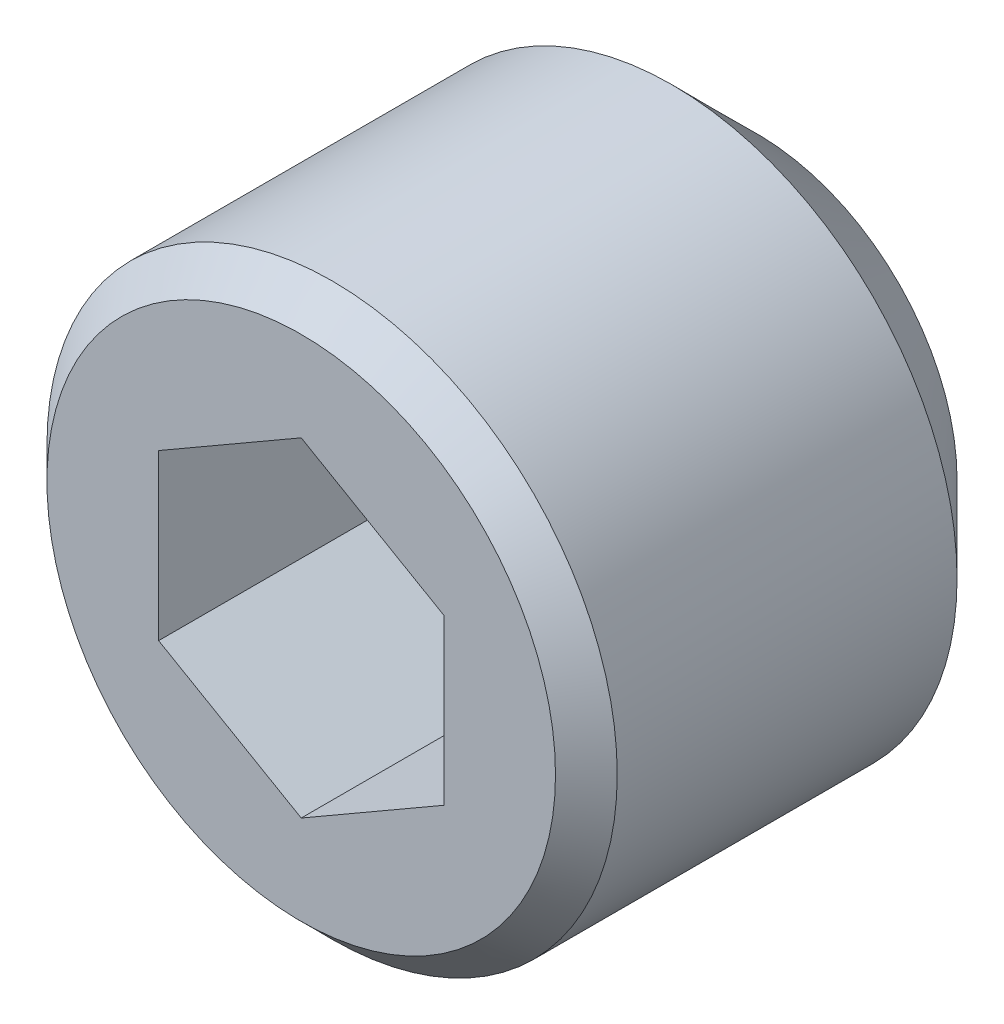
ISO-10303-21;
HEADER;
FILE_DESCRIPTION(('STEP AP214'),'2;1');
FILE_NAME('part.step','',(''),(''),'','','');
FILE_SCHEMA(('AUTOMOTIVE_DESIGN { 1 0 10303 214 1 1 1 1 }'));
ENDSEC;
DATA;
#1=APPLICATION_CONTEXT('core data for automotive mechanical design processes');
#2=APPLICATION_PROTOCOL_DEFINITION('international standard','automotive_design',2000,#1);
#3=PRODUCT_CONTEXT('',#1,'mechanical');
#4=PRODUCT('Part','Part','',(#3));
#5=PRODUCT_RELATED_PRODUCT_CATEGORY('part','',(#4));
#6=PRODUCT_DEFINITION_FORMATION('','',#4);
#7=PRODUCT_DEFINITION_CONTEXT('part definition',#1,'design');
#8=PRODUCT_DEFINITION('design','',#6,#7);
#9=PRODUCT_DEFINITION_SHAPE('','',#8);
#10=(LENGTH_UNIT() NAMED_UNIT(*) SI_UNIT(.MILLI.,.METRE.));
#11=(NAMED_UNIT(*) PLANE_ANGLE_UNIT() SI_UNIT($,.RADIAN.));
#12=(NAMED_UNIT(*) SI_UNIT($,.STERADIAN.) SOLID_ANGLE_UNIT());
#13=UNCERTAINTY_MEASURE_WITH_UNIT(LENGTH_MEASURE(1.E-05),#10,'distance_accuracy_value','');
#14=(GEOMETRIC_REPRESENTATION_CONTEXT(3) GLOBAL_UNCERTAINTY_ASSIGNED_CONTEXT((#13)) GLOBAL_UNIT_ASSIGNED_CONTEXT((#10,
#11,#12)) REPRESENTATION_CONTEXT('',''));
#15=CARTESIAN_POINT('',(0.,0.,0.));
#16=DIRECTION('',(0.,0.,1.));
#17=DIRECTION('',(1.,0.,0.));
#18=AXIS2_PLACEMENT_3D('',#15,#16,#17);
#19=CARTESIAN_POINT('',(0.,4.45875,0.));
#20=DIRECTION('',(0.,0.,-1.));
#21=DIRECTION('',(-1.,0.,0.));
#22=AXIS2_PLACEMENT_3D('',#19,#20,#21);
#23=PLANE('',#22);
#24=CARTESIAN_POINT('',(0.,0.,0.));
#25=DIRECTION('',(0.,0.,1.));
#26=DIRECTION('',(1.,0.,0.));
#27=AXIS2_PLACEMENT_3D('',#24,#25,#26);
#28=CIRCLE('',#27,4.45875);
#29=CARTESIAN_POINT('',(4.45875,0.,0.));
#30=VERTEX_POINT('',#29);
#31=EDGE_CURVE('E107',#30,#30,#28,.T.);
#32=ORIENTED_EDGE('',*,*,#31,.T.);
#33=EDGE_LOOP('',(#32));
#34=FACE_BOUND('',#33,.T.);
#35=DIRECTION('',(-0.866025403784438,-0.5,0.));
#36=VECTOR('',#35,1.);
#37=CARTESIAN_POINT('',(2.49999883437473,-1.443375,0.));
#38=LINE('',#37,#36);
#39=CARTESIAN_POINT('',(2.49999883437473,-1.443375,0.));
#40=VERTEX_POINT('',#39);
#41=CARTESIAN_POINT('',(0.,-2.88675,0.));
#42=VERTEX_POINT('',#41);
#43=EDGE_CURVE('E31',#40,#42,#38,.T.);
#44=ORIENTED_EDGE('',*,*,#43,.T.);
#45=DIRECTION('',(-0.866025403784439,0.5,0.));
#46=VECTOR('',#45,1.);
#47=CARTESIAN_POINT('',(0.,-2.88675,0.));
#48=LINE('',#47,#46);
#49=CARTESIAN_POINT('',(-2.49999883437473,-1.443375,0.));
#50=VERTEX_POINT('',#49);
#51=EDGE_CURVE('E153',#42,#50,#48,.T.);
#52=ORIENTED_EDGE('',*,*,#51,.T.);
#53=DIRECTION('',(0.,1.,0.));
#54=VECTOR('',#53,1.);
#55=CARTESIAN_POINT('',(-2.49999883437473,-1.443375,0.));
#56=LINE('',#55,#54);
#57=CARTESIAN_POINT('',(-2.49999883437473,1.443375,0.));
#58=VERTEX_POINT('',#57);
#59=EDGE_CURVE('E204',#50,#58,#56,.T.);
#60=ORIENTED_EDGE('',*,*,#59,.T.);
#61=DIRECTION('',(0.866025403784439,0.5,0.));
#62=VECTOR('',#61,1.);
#63=CARTESIAN_POINT('',(-2.49999883437473,1.443375,0.));
#64=LINE('',#63,#62);
#65=CARTESIAN_POINT('',(0.,2.88675,0.));
#66=VERTEX_POINT('',#65);
#67=EDGE_CURVE('E202',#58,#66,#64,.T.);
#68=ORIENTED_EDGE('',*,*,#67,.T.);
#69=DIRECTION('',(0.866025403784439,-0.5,0.));
#70=VECTOR('',#69,1.);
#71=CARTESIAN_POINT('',(0.,2.88675,0.));
#72=LINE('',#71,#70);
#73=CARTESIAN_POINT('',(2.49999883437473,1.443375,0.));
#74=VERTEX_POINT('',#73);
#75=EDGE_CURVE('E96',#66,#74,#72,.T.);
#76=ORIENTED_EDGE('',*,*,#75,.T.);
#77=DIRECTION('',(0.,-1.,0.));
#78=VECTOR('',#77,1.);
#79=CARTESIAN_POINT('',(2.49999883437473,1.443375,0.));
#80=LINE('',#79,#78);
#81=EDGE_CURVE('E92',#74,#40,#80,.T.);
#82=ORIENTED_EDGE('',*,*,#81,.T.);
#83=EDGE_LOOP('',(#44,#52,#60,#68,#76,#82));
#84=FACE_BOUND('',#83,.T.);
#85=ADVANCED_FACE('F17',(#34,#84),#23,.F.);
#86=CARTESIAN_POINT('',(0.,0.,-8.));
#87=DIRECTION('',(0.,0.,1.));
#88=DIRECTION('',(1.,0.,0.));
#89=AXIS2_PLACEMENT_3D('',#86,#87,#88);
#90=PLANE('',#89);
#91=CARTESIAN_POINT('',(0.,0.,-8.));
#92=DIRECTION('',(0.,0.,1.));
#93=DIRECTION('',(1.,0.,0.));
#94=AXIS2_PLACEMENT_3D('',#91,#92,#93);
#95=CIRCLE('',#94,3.5);
#96=CARTESIAN_POINT('',(3.5,0.,-8.));
#97=VERTEX_POINT('',#96);
#98=EDGE_CURVE('E11',#97,#97,#95,.T.);
#99=ORIENTED_EDGE('',*,*,#98,.F.);
#100=EDGE_LOOP('',(#99));
#101=FACE_BOUND('',#100,.T.);
#102=ADVANCED_FACE('F120',(#101),#90,.F.);
#103=CARTESIAN_POINT('',(0.,0.,-8.));
#104=DIRECTION('',(0.,0.,1.));
#105=DIRECTION('',(1.,0.,0.));
#106=AXIS2_PLACEMENT_3D('',#103,#104,#105);
#107=CONICAL_SURFACE('',#106,3.5,0.785398163397449);
#108=CARTESIAN_POINT('',(0.,0.,-6.5));
#109=DIRECTION('',(0.,0.,1.));
#110=DIRECTION('',(1.,0.,0.));
#111=AXIS2_PLACEMENT_3D('',#108,#109,#110);
#112=CIRCLE('',#111,5.);
#113=CARTESIAN_POINT('',(5.,0.,-6.5));
#114=VERTEX_POINT('',#113);
#115=EDGE_CURVE('E24',#114,#114,#112,.T.);
#116=ORIENTED_EDGE('',*,*,#115,.F.);
#117=EDGE_LOOP('',(#116));
#118=FACE_BOUND('',#117,.T.);
#119=ORIENTED_EDGE('',*,*,#98,.T.);
#120=EDGE_LOOP('',(#119));
#121=FACE_BOUND('',#120,.T.);
#122=ADVANCED_FACE('F117',(#118,#121),#107,.T.);
#123=CARTESIAN_POINT('',(0.,0.,0.));
#124=DIRECTION('',(0.,0.,1.));
#125=DIRECTION('',(1.,0.,0.));
#126=AXIS2_PLACEMENT_3D('',#123,#124,#125);
#127=CYLINDRICAL_SURFACE('',#126,5.);
#128=CARTESIAN_POINT('',(0.,0.,-0.54125));
#129=DIRECTION('',(0.,0.,1.));
#130=DIRECTION('',(1.,0.,0.));
#131=AXIS2_PLACEMENT_3D('',#128,#129,#130);
#132=CIRCLE('',#131,5.);
#133=CARTESIAN_POINT('',(5.,0.,-0.54125));
#134=VERTEX_POINT('',#133);
#135=EDGE_CURVE('E110',#134,#134,#132,.T.);
#136=ORIENTED_EDGE('',*,*,#135,.F.);
#137=EDGE_LOOP('',(#136));
#138=FACE_BOUND('',#137,.T.);
#139=ORIENTED_EDGE('',*,*,#115,.T.);
#140=EDGE_LOOP('',(#139));
#141=FACE_BOUND('',#140,.T.);
#142=ADVANCED_FACE('F115',(#138,#141),#127,.T.);
#143=CARTESIAN_POINT('',(0.,0.,-0.54125));
#144=DIRECTION('',(0.,0.,-1.));
#145=DIRECTION('',(-1.,0.,0.));
#146=AXIS2_PLACEMENT_3D('',#143,#144,#145);
#147=CONICAL_SURFACE('',#146,5.,0.785398163397448);
#148=ORIENTED_EDGE('',*,*,#31,.F.);
#149=EDGE_LOOP('',(#148));
#150=FACE_BOUND('',#149,.T.);
#151=ORIENTED_EDGE('',*,*,#135,.T.);
#152=EDGE_LOOP('',(#151));
#153=FACE_BOUND('',#152,.T.);
#154=ADVANCED_FACE('F133',(#150,#153),#147,.T.);
#155=CARTESIAN_POINT('',(2.49999883437473,-1.443375,-5.66666588958315));
#156=DIRECTION('',(-0.5,0.866025403784438,0.));
#157=DIRECTION('',(0.866025403784439,0.5,0.));
#158=AXIS2_PLACEMENT_3D('',#155,#156,#157);
#159=PLANE('',#158);
#160=DIRECTION('',(0.,0.,1.));
#161=VECTOR('',#160,1.);
#162=CARTESIAN_POINT('',(0.,-2.88675,-5.66666588958315));
#163=LINE('',#162,#161);
#164=CARTESIAN_POINT('',(0.,-2.88675,-4.));
#165=VERTEX_POINT('',#164);
#166=EDGE_CURVE('E105',#165,#42,#163,.T.);
#167=ORIENTED_EDGE('',*,*,#166,.T.);
#168=ORIENTED_EDGE('',*,*,#43,.F.);
#169=DIRECTION('',(0.,0.,1.));
#170=VECTOR('',#169,1.);
#171=CARTESIAN_POINT('',(2.49999883437473,-1.443375,-5.66666588958315));
#172=LINE('',#171,#170);
#173=CARTESIAN_POINT('',(2.49999883437473,-1.443375,-4.));
#174=VERTEX_POINT('',#173);
#175=EDGE_CURVE('E86',#174,#40,#172,.T.);
#176=ORIENTED_EDGE('',*,*,#175,.F.);
#177=CARTESIAN_POINT('',(-1.99999999401565E-07,-2.88675011547006,-3.99999993333333));
#178=CARTESIAN_POINT('',(0.10985961160669,-2.82332252366581,-4.03663049032172));
#179=CARTESIAN_POINT('',(0.220667731536841,-2.75934742579574,-4.06994406563847));
#180=CARTESIAN_POINT('',(0.444202540147257,-2.63028954387127,-4.12809191272334));
#181=CARTESIAN_POINT('',(0.556933199317606,-2.56520446745334,-4.15290561622927));
#182=CARTESIAN_POINT('',(0.78099750300855,-2.43584088140159,-4.19152993731165));
#183=CARTESIAN_POINT('',(0.892296682007637,-2.37158227044588,-4.20559765108009));
#184=CARTESIAN_POINT('',(1.11541846658836,-2.24276284805614,-4.22238842945382));
#185=CARTESIAN_POINT('',(1.22724026173863,-2.17820250452486,-4.22512540160635));
#186=CARTESIAN_POINT('',(1.43616731638533,-2.05757841328359,-4.21941704310204));
#187=CARTESIAN_POINT('',(1.53330392697905,-2.00149656500914,-4.2123733036678));
#188=CARTESIAN_POINT('',(1.72694433478895,-1.8896982234341,-4.19005329169059));
#189=CARTESIAN_POINT('',(1.82344746275382,-1.83398211652594,-4.17476940212666));
#190=CARTESIAN_POINT('',(2.01748678854571,-1.72195345954662,-4.13656263384661));
#191=CARTESIAN_POINT('',(2.11499844044762,-1.66565508107193,-4.11347787458928));
#192=CARTESIAN_POINT('',(2.3085677780308,-1.55389777191142,-4.06108522951028));
#193=CARTESIAN_POINT('',(2.40462794164891,-1.49843741058811,-4.03178964598496));
#194=CARTESIAN_POINT('',(2.49999903437473,-1.44337488452994,-3.99999993333333));
#195=B_SPLINE_CURVE_WITH_KNOTS('',3,(#177,#178,#179,#180,#181,#182,#183,#184,#185,#186,#187,
#188,#189,#190,#191,#192,#193,#194),.UNSPECIFIED.,.F.,.F.,(4,2,2,2,2,2,2,2,4),(0.,
0.396269845497157,0.793491933375094,1.18088400346178,1.56780044062153,1.90463400294076,
2.24177946228527,2.58640119548574,2.93034658115087),.UNSPECIFIED.);
#196=EDGE_CURVE('E79',#165,#174,#195,.T.);
#197=ORIENTED_EDGE('',*,*,#196,.F.);
#198=EDGE_LOOP('',(#167,#168,#176,#197));
#199=FACE_BOUND('',#198,.T.);
#200=ADVANCED_FACE('F87',(#199),#159,.T.);
#201=CARTESIAN_POINT('',(0.,-2.88675,-5.66666588958315));
#202=DIRECTION('',(0.5,0.866025403784439,0.));
#203=DIRECTION('',(0.866025403784439,-0.5,0.));
#204=AXIS2_PLACEMENT_3D('',#201,#202,#203);
#205=PLANE('',#204);
#206=DIRECTION('',(0.,0.,1.));
#207=VECTOR('',#206,1.);
#208=CARTESIAN_POINT('',(-2.49999883437473,-1.443375,-5.66666588958315));
#209=LINE('',#208,#207);
#210=CARTESIAN_POINT('',(-2.49999883437473,-1.443375,-4.));
#211=VERTEX_POINT('',#210);
#212=EDGE_CURVE('E103',#211,#50,#209,.T.);
#213=ORIENTED_EDGE('',*,*,#212,.T.);
#214=ORIENTED_EDGE('',*,*,#51,.F.);
#215=ORIENTED_EDGE('',*,*,#166,.F.);
#216=CARTESIAN_POINT('',(-2.49999903437473,-1.44337488452995,-3.99999993333333));
#217=CARTESIAN_POINT('',(-2.39013922276804,-1.50680247633419,-4.03663049032172));
#218=CARTESIAN_POINT('',(-2.27933110283789,-1.57077757420426,-4.06994406563847));
#219=CARTESIAN_POINT('',(-2.05579629422747,-1.69983545612873,-4.12809191272334));
#220=CARTESIAN_POINT('',(-1.94306563505712,-1.76492053254666,-4.15290561622927));
#221=CARTESIAN_POINT('',(-1.71900133136618,-1.89428411859841,-4.19152993731165));
#222=CARTESIAN_POINT('',(-1.60770215236709,-1.95854272955412,-4.20559765108009));
#223=CARTESIAN_POINT('',(-1.38458036778637,-2.08736215194387,-4.22238842945383));
#224=CARTESIAN_POINT('',(-1.2727585726361,-2.15192249547514,-4.22512540160635));
#225=CARTESIAN_POINT('',(-1.06383151798939,-2.27254658671641,-4.21941704310204));
#226=CARTESIAN_POINT('',(-0.966694907395679,-2.32862843499086,-4.2123733036678));
#227=CARTESIAN_POINT('',(-0.773054499585779,-2.4404267765659,-4.19005329169059));
#228=CARTESIAN_POINT('',(-0.676551371620906,-2.49614288347406,-4.17476940212666));
#229=CARTESIAN_POINT('',(-0.482512045829019,-2.60817154045338,-4.13656263384662));
#230=CARTESIAN_POINT('',(-0.385000393927105,-2.66446991892807,-4.11347787458929));
#231=CARTESIAN_POINT('',(-0.191431056343927,-2.77622722808858,-4.06108522951028));
#232=CARTESIAN_POINT('',(-0.0953708927258206,-2.83168758941189,-4.03178964598496));
#233=CARTESIAN_POINT('',(2.00000001119725E-07,-2.88675011547006,-3.99999993333333));
#234=B_SPLINE_CURVE_WITH_KNOTS('',3,(#216,#217,#218,#219,#220,#221,#222,#223,#224,#225,#226,
#227,#228,#229,#230,#231,#232,#233),.UNSPECIFIED.,.F.,.F.,(4,2,2,2,2,2,2,2,4),(0.,
0.396269845497158,0.793491933375095,1.18088400346178,1.56780044062153,1.90463400294076,
2.24177946228527,2.58640119548574,2.93034658115087),.UNSPECIFIED.);
#235=EDGE_CURVE('E83',#211,#165,#234,.T.);
#236=ORIENTED_EDGE('',*,*,#235,.F.);
#237=EDGE_LOOP('',(#213,#214,#215,#236));
#238=FACE_BOUND('',#237,.T.);
#239=ADVANCED_FACE('F141',(#238),#205,.T.);
#240=CARTESIAN_POINT('',(-2.49999883437473,-1.443375,-5.66666588958315));
#241=DIRECTION('',(1.,0.,0.));
#242=DIRECTION('',(0.,-1.,0.));
#243=AXIS2_PLACEMENT_3D('',#240,#241,#242);
#244=PLANE('',#243);
#245=DIRECTION('',(0.,0.,1.));
#246=VECTOR('',#245,1.);
#247=CARTESIAN_POINT('',(-2.49999883437473,1.443375,-5.66666588958315));
#248=LINE('',#247,#246);
#249=CARTESIAN_POINT('',(-2.49999883437473,1.443375,-4.));
#250=VERTEX_POINT('',#249);
#251=EDGE_CURVE('E101',#250,#58,#248,.T.);
#252=ORIENTED_EDGE('',*,*,#251,.T.);
#253=ORIENTED_EDGE('',*,*,#59,.F.);
#254=ORIENTED_EDGE('',*,*,#212,.F.);
#255=CARTESIAN_POINT('',(-2.49999883437473,-3.73786106080538,-3.07041221157194));
#256=CARTESIAN_POINT('',(-2.49999883437472,-3.62990250206732,-3.12220664287122));
#257=CARTESIAN_POINT('',(-2.49999883437472,-3.52168094152775,-3.17346309581262));
#258=CARTESIAN_POINT('',(-2.49999883437472,-3.30457164380933,-3.27459485889545));
#259=CARTESIAN_POINT('',(-2.49999883437473,-3.19568379099059,-3.32446992047824));
#260=CARTESIAN_POINT('',(-2.49999883437473,-2.97647740444845,-3.42281234276485));
#261=CARTESIAN_POINT('',(-2.49999883437473,-2.86615419888697,-3.47126932906307));
#262=CARTESIAN_POINT('',(-2.49999883437473,-2.64458202766207,-3.56601036918079));
#263=CARTESIAN_POINT('',(-2.49999883437473,-2.53333311048903,-3.61229453598331));
#264=CARTESIAN_POINT('',(-2.49999883437473,-2.30680205753004,-3.70328992467512));
#265=CARTESIAN_POINT('',(-2.49999883437473,-2.19149051987882,-3.74792838115549));
#266=CARTESIAN_POINT('',(-2.49999883437473,-1.95947266345193,-3.8334940158411));
#267=CARTESIAN_POINT('',(-2.49999883437473,-1.84276618467434,-3.87442076359324));
#268=CARTESIAN_POINT('',(-2.49999883437473,-1.60804233885086,-3.95139261003084));
#269=CARTESIAN_POINT('',(-2.49999883437473,-1.49002871420931,-3.98744899818757));
#270=CARTESIAN_POINT('',(-2.49999883437473,-1.2523101438379,-4.05344705166944));
#271=CARTESIAN_POINT('',(-2.49999883437473,-1.13260562607739,-4.08339023562997));
#272=CARTESIAN_POINT('',(-2.49999883437473,-0.89175462475313,-4.13556568390413));
#273=CARTESIAN_POINT('',(-2.49999883437473,-0.770611639993448,-4.15781378548432));
#274=CARTESIAN_POINT('',(-2.49999883437473,-0.5269703393632,-4.19314222529211));
#275=CARTESIAN_POINT('',(-2.49999883437473,-0.404472115650476,-4.20622318305106));
#276=CARTESIAN_POINT('',(-2.49999883437473,-0.160266323382075,-4.2220036785792));
#277=CARTESIAN_POINT('',(-2.49999883437472,-0.0385668671239495,-4.22482572411308));
#278=CARTESIAN_POINT('',(-2.49999883437473,0.204641816247535,-4.22016410990035));
#279=CARTESIAN_POINT('',(-2.49999883437473,0.326151031115554,-4.21267981202642));
#280=CARTESIAN_POINT('',(-2.49999883437473,0.536550258216571,-4.19130128655531));
#281=CARTESIAN_POINT('',(-2.49999883437473,0.625672904642507,-4.17959110975167));
#282=CARTESIAN_POINT('',(-2.49999883437473,0.803172917295863,-4.15143172061358));
#283=CARTESIAN_POINT('',(-2.49999883437473,0.89155015184042,-4.13498168827596));
#284=CARTESIAN_POINT('',(-2.49999883437473,1.15551819027777,-4.07939182444342));
#285=CARTESIAN_POINT('',(-2.49999883437473,1.32980784061724,-4.03402791877732));
#286=CARTESIAN_POINT('',(-2.49999883437473,1.59042319534384,-3.95652590664815));
#287=CARTESIAN_POINT('',(-2.49999883437473,1.67812270299027,-3.92875434787049));
#288=CARTESIAN_POINT('',(-2.49999883437473,1.85261386500735,-3.87064301388239));
#289=CARTESIAN_POINT('',(-2.49999883437473,1.93940604847369,-3.84030484144072));
#290=CARTESIAN_POINT('',(-2.49999883437473,2.11219207993987,-3.77749987485625));
#291=CARTESIAN_POINT('',(-2.49999883437473,2.19818606979953,-3.74503346755841));
#292=CARTESIAN_POINT('',(-2.49999883437473,2.36949689832585,-3.67832370020374));
#293=CARTESIAN_POINT('',(-2.49999883437473,2.45481361975971,-3.64408003992356));
#294=CARTESIAN_POINT('',(-2.49999883437473,2.67258663691751,-3.5544775289021));
#295=CARTESIAN_POINT('',(-2.49999883437473,2.80460717975266,-3.49806097487821));
#296=CARTESIAN_POINT('',(-2.49999883437473,3.06745885209088,-3.38251374932939));
#297=CARTESIAN_POINT('',(-2.49999883437473,3.19828989160955,-3.32338287448291));
#298=CARTESIAN_POINT('',(-2.49999883437473,3.45900849771502,-3.20302339623139));
#299=CARTESIAN_POINT('',(-2.49999883437473,3.588895895855,-3.14179442893665));
#300=CARTESIAN_POINT('',(-2.49999883437473,3.84788844979156,-3.01770131069641));
#301=CARTESIAN_POINT('',(-2.49999883437473,3.97699358811348,-2.95483712338704));
#302=CARTESIAN_POINT('',(-2.49999883437473,4.36366789578639,-2.76416837589586));
#303=CARTESIAN_POINT('',(-2.49999883437473,4.62028438307696,-2.63443362109789));
#304=CARTESIAN_POINT('',(-2.49999883437473,5.13176032193984,-2.37164618514162));
#305=CARTESIAN_POINT('',(-2.49999883437473,5.38661999164569,-2.23859392572743));
#306=CARTESIAN_POINT('',(-2.49999883437473,5.87112445771686,-1.98285372670787));
#307=CARTESIAN_POINT('',(-2.49999883437473,6.1008787283855,-1.86037285506766));
#308=CARTESIAN_POINT('',(-2.49999883437473,6.55964828623937,-1.61401665056899));
#309=CARTESIAN_POINT('',(-2.49999883437473,6.78866354567112,-1.49014126610625));
#310=CARTESIAN_POINT('',(-2.49999883437473,7.24554286262024,-1.24166107037196));
#311=CARTESIAN_POINT('',(-2.49999883437473,7.47340836663001,-1.11705891580744));
#312=CARTESIAN_POINT('',(-2.49999883437473,7.92867868321813,-0.867043623047067));
#313=CARTESIAN_POINT('',(-2.49999883437473,8.15608351928125,-0.741630527632687));
#314=CARTESIAN_POINT('',(-2.49999883437473,8.38332285644868,-0.615920192581907));
#315=B_SPLINE_CURVE_WITH_KNOTS('',3,(#255,#256,#257,#258,#259,#260,#261,#262,#263,#264,#265,
#266,#267,#268,#269,#270,#271,#272,#273,#274,#275,#276,#277,#278,#279,#280,#281,#282,#283,#284,
#285,#286,#287,#288,#289,#290,#291,#292,#293,#294,#295,#296,#297,#298,#299,#300,#301,#302,#303,
#304,#305,#306,#307,#308,#309,#310,#311,#312,#313,#314),.UNSPECIFIED.,.F.,.F.,(4,2,2,2,2,2,2,2,
2,2,2,2,2,2,2,2,2,2,2,2,2,2,2,2,2,2,2,2,2,4),(0.,0.359225681431817,0.718515585139895,
1.07998495417534,1.44143550653757,1.81233642904487,2.18328031069956,2.55334902389717,
2.92332569287424,3.29253631672425,3.66172198627915,4.02648423442986,4.39126906820634,
4.66080188136147,4.930381352183,5.46995360256796,5.74590907077785,6.021693467888,
6.29742787448485,6.57320901222719,7.00387397984081,7.43457126007159,7.86534362162853,
8.29612557086707,9.1587214959853,10.0212083154897,10.8022890544959,11.5833987932307,
12.3625217727531,13.1416039793722),.UNSPECIFIED.);
#316=EDGE_CURVE('E178',#250,#211,#315,.F.);
#317=ORIENTED_EDGE('',*,*,#316,.F.);
#318=EDGE_LOOP('',(#252,#253,#254,#317));
#319=FACE_BOUND('',#318,.T.);
#320=ADVANCED_FACE('F182',(#319),#244,.T.);
#321=CARTESIAN_POINT('',(-2.49999883437473,1.443375,-5.66666588958315));
#322=DIRECTION('',(0.5,-0.866025403784438,0.));
#323=DIRECTION('',(-0.866025403784439,-0.5,0.));
#324=AXIS2_PLACEMENT_3D('',#321,#322,#323);
#325=PLANE('',#324);
#326=DIRECTION('',(0.,0.,1.));
#327=VECTOR('',#326,1.);
#328=CARTESIAN_POINT('',(0.,2.88675,-5.66666588958315));
#329=LINE('',#328,#327);
#330=CARTESIAN_POINT('',(0.,2.88675,-4.));
#331=VERTEX_POINT('',#330);
#332=EDGE_CURVE('E94',#331,#66,#329,.T.);
#333=ORIENTED_EDGE('',*,*,#332,.T.);
#334=ORIENTED_EDGE('',*,*,#67,.F.);
#335=ORIENTED_EDGE('',*,*,#251,.F.);
#336=CARTESIAN_POINT('',(2.0000000023838E-07,2.88675011547006,-3.99999993333333));
#337=CARTESIAN_POINT('',(-0.10985961160669,2.82332252366581,-4.03663049032172));
#338=CARTESIAN_POINT('',(-0.220667731536841,2.75934742579574,-4.06994406563847));
#339=CARTESIAN_POINT('',(-0.444202540147257,2.63028954387127,-4.12809191272334));
#340=CARTESIAN_POINT('',(-0.556933199317606,2.56520446745334,-4.15290561622927));
#341=CARTESIAN_POINT('',(-0.78099750300855,2.43584088140159,-4.19152993731165));
#342=CARTESIAN_POINT('',(-0.892296682007636,2.37158227044588,-4.20559765108009));
#343=CARTESIAN_POINT('',(-1.11541846658836,2.24276284805614,-4.22238842945382));
#344=CARTESIAN_POINT('',(-1.22724026173863,2.17820250452486,-4.22512540160635));
#345=CARTESIAN_POINT('',(-1.43616731638533,2.05757841328359,-4.21941704310204));
#346=CARTESIAN_POINT('',(-1.53330392697905,2.00149656500914,-4.2123733036678));
#347=CARTESIAN_POINT('',(-1.72694433478895,1.8896982234341,-4.19005329169059));
#348=CARTESIAN_POINT('',(-1.82344746275382,1.83398211652594,-4.17476940212666));
#349=CARTESIAN_POINT('',(-2.01748678854571,1.72195345954662,-4.13656263384661));
#350=CARTESIAN_POINT('',(-2.11499844044762,1.66565508107193,-4.11347787458928));
#351=CARTESIAN_POINT('',(-2.3085677780308,1.55389777191142,-4.06108522951028));
#352=CARTESIAN_POINT('',(-2.40462794164891,1.49843741058811,-4.03178964598496));
#353=CARTESIAN_POINT('',(-2.49999903437473,1.44337488452994,-3.99999993333333));
#354=B_SPLINE_CURVE_WITH_KNOTS('',3,(#336,#337,#338,#339,#340,#341,#342,#343,#344,#345,#346,
#347,#348,#349,#350,#351,#352,#353),.UNSPECIFIED.,.F.,.F.,(4,2,2,2,2,2,2,2,4),(0.,
0.396269845497158,0.793491933375094,1.18088400346178,1.56780044062153,1.90463400294076,
2.24177946228527,2.58640119548574,2.93034658115087),.UNSPECIFIED.);
#355=EDGE_CURVE('E173',#331,#250,#354,.T.);
#356=ORIENTED_EDGE('',*,*,#355,.F.);
#357=EDGE_LOOP('',(#333,#334,#335,#356));
#358=FACE_BOUND('',#357,.T.);
#359=ADVANCED_FACE('F185',(#358),#325,.T.);
#360=CARTESIAN_POINT('',(0.,2.88675,-5.66666588958315));
#361=DIRECTION('',(-0.5,-0.866025403784439,0.));
#362=DIRECTION('',(-0.866025403784439,0.5,0.));
#363=AXIS2_PLACEMENT_3D('',#360,#361,#362);
#364=PLANE('',#363);
#365=DIRECTION('',(0.,0.,1.));
#366=VECTOR('',#365,1.);
#367=CARTESIAN_POINT('',(2.49999883437473,1.443375,-5.66666588958315));
#368=LINE('',#367,#366);
#369=CARTESIAN_POINT('',(2.49999883437473,1.443375,-4.));
#370=VERTEX_POINT('',#369);
#371=EDGE_CURVE('E91',#370,#74,#368,.T.);
#372=ORIENTED_EDGE('',*,*,#371,.T.);
#373=ORIENTED_EDGE('',*,*,#75,.F.);
#374=ORIENTED_EDGE('',*,*,#332,.F.);
#375=CARTESIAN_POINT('',(2.49999903437473,1.44337488452995,-3.99999993333333));
#376=CARTESIAN_POINT('',(2.39013922276804,1.50680247633419,-4.03663049032172));
#377=CARTESIAN_POINT('',(2.27933110283789,1.57077757420426,-4.06994406563847));
#378=CARTESIAN_POINT('',(2.05579629422747,1.69983545612873,-4.12809191272334));
#379=CARTESIAN_POINT('',(1.94306563505712,1.76492053254666,-4.15290561622927));
#380=CARTESIAN_POINT('',(1.71900133136618,1.89428411859841,-4.19152993731165));
#381=CARTESIAN_POINT('',(1.60770215236709,1.95854272955412,-4.20559765108009));
#382=CARTESIAN_POINT('',(1.38458036778637,2.08736215194387,-4.22238842945383));
#383=CARTESIAN_POINT('',(1.2727585726361,2.15192249547514,-4.22512540160635));
#384=CARTESIAN_POINT('',(1.06383151798939,2.27254658671641,-4.21941704310204));
#385=CARTESIAN_POINT('',(0.966694907395678,2.32862843499086,-4.2123733036678));
#386=CARTESIAN_POINT('',(0.773054499585779,2.4404267765659,-4.19005329169059));
#387=CARTESIAN_POINT('',(0.676551371620906,2.49614288347406,-4.17476940212666));
#388=CARTESIAN_POINT('',(0.482512045829019,2.60817154045338,-4.13656263384662));
#389=CARTESIAN_POINT('',(0.385000393927105,2.66446991892807,-4.11347787458929));
#390=CARTESIAN_POINT('',(0.191431056343928,2.77622722808858,-4.06108522951028));
#391=CARTESIAN_POINT('',(0.0953708927258218,2.83168758941189,-4.03178964598496));
#392=CARTESIAN_POINT('',(-2.00000000048391E-07,2.88675011547006,-3.99999993333333));
#393=B_SPLINE_CURVE_WITH_KNOTS('',3,(#375,#376,#377,#378,#379,#380,#381,#382,#383,#384,#385,
#386,#387,#388,#389,#390,#391,#392),.UNSPECIFIED.,.F.,.F.,(4,2,2,2,2,2,2,2,4),(0.,
0.396269845497158,0.793491933375095,1.18088400346178,1.56780044062153,1.90463400294076,
2.24177946228527,2.58640119548574,2.93034658115087),.UNSPECIFIED.);
#394=EDGE_CURVE('E39',#370,#331,#393,.T.);
#395=ORIENTED_EDGE('',*,*,#394,.F.);
#396=EDGE_LOOP('',(#372,#373,#374,#395));
#397=FACE_BOUND('',#396,.T.);
#398=ADVANCED_FACE('F189',(#397),#364,.T.);
#399=CARTESIAN_POINT('',(2.49999883437473,1.443375,-5.66666588958315));
#400=DIRECTION('',(-1.,0.,0.));
#401=DIRECTION('',(0.,1.,0.));
#402=AXIS2_PLACEMENT_3D('',#399,#400,#401);
#403=PLANE('',#402);
#404=ORIENTED_EDGE('',*,*,#175,.T.);
#405=ORIENTED_EDGE('',*,*,#81,.F.);
#406=ORIENTED_EDGE('',*,*,#371,.F.);
#407=CARTESIAN_POINT('',(2.49999883437473,-3.73786106214978,-3.07041221092676));
#408=CARTESIAN_POINT('',(2.49999883437473,-3.62990250336578,-3.12220664225383));
#409=CARTESIAN_POINT('',(2.49999883437473,-3.52168094278023,-3.17346309522301));
#410=CARTESIAN_POINT('',(2.49999883437473,-3.30457164496968,-3.27459485836123));
#411=CARTESIAN_POINT('',(2.49999883437473,-3.19568379210479,-3.32446991997165));
#412=CARTESIAN_POINT('',(2.49999883437473,-2.97647740546948,-3.42281234231354));
#413=CARTESIAN_POINT('',(2.49999883437473,-2.86615419986097,-3.4712693286394));
#414=CARTESIAN_POINT('',(2.49999883437473,-2.64458202854164,-3.56601036881189));
#415=CARTESIAN_POINT('',(2.49999883437473,-2.5333331113212,-3.61229453564152));
#416=CARTESIAN_POINT('',(2.49999883437473,-2.30680205826466,-3.70328992438774));
#417=CARTESIAN_POINT('',(2.49999883437473,-2.19149052056326,-3.74792838089534));
#418=CARTESIAN_POINT('',(2.49999883437473,-1.95947266403511,-3.83349401563376));
#419=CARTESIAN_POINT('',(2.49999883437473,-1.84276618520645,-3.87442076341148));
#420=CARTESIAN_POINT('',(2.49999883437473,-1.60804233927986,-3.95139260989741));
#421=CARTESIAN_POINT('',(2.49999883437473,-1.49002871458628,-3.98744899807691));
#422=CARTESIAN_POINT('',(2.49999883437473,-1.25231014410934,-4.05344705160007));
#423=CARTESIAN_POINT('',(2.49999883437473,-1.13260562629533,-4.08339023557912));
#424=CARTESIAN_POINT('',(2.49999883437473,-0.89175462484745,-4.13556568388731));
#425=CARTESIAN_POINT('',(2.49999883437473,-0.77061164001744,-4.15781378548204));
#426=CARTESIAN_POINT('',(2.49999883437473,-0.526970339245063,-4.19314222530803));
#427=CARTESIAN_POINT('',(2.49999883437473,-0.404472115460539,-4.20622318307062));
#428=CARTESIAN_POINT('',(2.49999883437473,-0.160266323049875,-4.22200367859346));
#429=CARTESIAN_POINT('',(2.49999883437473,-0.0385668667212923,-4.2248257241186));
#430=CARTESIAN_POINT('',(2.49999883437473,0.204641816789788,-4.22016410987671));
#431=CARTESIAN_POINT('',(2.49999883437473,0.326151031726945,-4.21267981198237));
#432=CARTESIAN_POINT('',(2.49999883437473,0.536550258918092,-4.19130128647063));
#433=CARTESIAN_POINT('',(2.49999883437473,0.625672905365761,-4.17959110965051));
#434=CARTESIAN_POINT('',(2.49999883437473,0.803172918061717,-4.15143172047851));
#435=CARTESIAN_POINT('',(2.49999883437473,0.891550152627141,-4.13498168812348));
#436=CARTESIAN_POINT('',(2.49999883437473,1.15551819112615,-4.07939182423827));
#437=CARTESIAN_POINT('',(2.49999883437473,1.32980784150537,-4.03402791853649));
#438=CARTESIAN_POINT('',(2.49999883437473,1.59042319629154,-3.95652590635442));
#439=CARTESIAN_POINT('',(2.49999883437473,1.67812270395821,-3.92875434755899));
#440=CARTESIAN_POINT('',(2.49999883437473,1.85261386601558,-3.87064301353577));
#441=CARTESIAN_POINT('',(2.49999883437473,1.93940604950196,-3.84030484107677));
#442=CARTESIAN_POINT('',(2.49999883437473,2.11219208100812,-3.77749987445815));
#443=CARTESIAN_POINT('',(2.49999883437473,2.19818607088772,-3.74503346714349));
#444=CARTESIAN_POINT('',(2.49999883437473,2.36949689945393,-3.67832369975564));
#445=CARTESIAN_POINT('',(2.49999883437473,2.45481362090775,-3.6440800394591));
#446=CARTESIAN_POINT('',(2.49999883437472,2.67258663807879,-3.55447752841191));
#447=CARTESIAN_POINT('',(2.49999883437473,2.80460718090767,-3.49806097438));
#448=CARTESIAN_POINT('',(2.49999883437473,3.06745885323414,-3.38251374881733));
#449=CARTESIAN_POINT('',(2.49999883437473,3.19828989274733,-3.32338287396504));
#450=CARTESIAN_POINT('',(2.49999883437473,3.45900849884241,-3.20302339570355));
#451=CARTESIAN_POINT('',(2.49999883437473,3.58889589697747,-3.14179442840464));
#452=CARTESIAN_POINT('',(2.49999883437473,3.84788845090471,-3.01770131015726));
#453=CARTESIAN_POINT('',(2.49999883437473,3.97699358922221,-2.95483712284492));
#454=CARTESIAN_POINT('',(2.49999883437473,4.36366789688205,-2.7641683753463));
#455=CARTESIAN_POINT('',(2.49999883437473,4.62028438416454,-2.63443362054519));
#456=CARTESIAN_POINT('',(2.49999883437473,5.1317603230123,-2.37164618458458));
#457=CARTESIAN_POINT('',(2.49999883437473,5.3866199927111,-2.23859392516921));
#458=CARTESIAN_POINT('',(2.49999883437473,5.87112445877585,-1.98285372614516));
#459=CARTESIAN_POINT('',(2.49999883437473,6.10087872944505,-1.86037285450148));
#460=CARTESIAN_POINT('',(2.49999883437473,6.55964828730031,-1.6140166499965));
#461=CARTESIAN_POINT('',(2.49999883437473,6.78866354673291,-1.4901412655309));
#462=CARTESIAN_POINT('',(2.49999883437473,7.24554286368472,-1.24166106979091));
#463=CARTESIAN_POINT('',(2.49999883437473,7.47340836769633,-1.11705891522353));
#464=CARTESIAN_POINT('',(2.49999883437473,7.92867868428833,-0.86704362245773));
#465=CARTESIAN_POINT('',(2.49999883437473,8.15608352035347,-0.741630527040781));
#466=CARTESIAN_POINT('',(2.49999883437473,8.38332285752298,-0.615920191987526));
#467=B_SPLINE_CURVE_WITH_KNOTS('',3,(#407,#408,#409,#410,#411,#412,#413,#414,#415,#416,#417,
#418,#419,#420,#421,#422,#423,#424,#425,#426,#427,#428,#429,#430,#431,#432,#433,#434,#435,#436,
#437,#438,#439,#440,#441,#442,#443,#444,#445,#446,#447,#448,#449,#450,#451,#452,#453,#454,#455,
#456,#457,#458,#459,#460,#461,#462,#463,#464,#465,#466),.UNSPECIFIED.,.F.,.F.,(4,2,2,2,2,2,2,2,
2,2,2,2,2,2,2,2,2,2,2,2,2,2,2,2,2,2,2,2,2,4),(0.,0.359225681592158,0.718515585460605,
1.07998495465858,1.44143550718335,1.81233642986051,2.18328031168514,2.55334902505187,
2.92332569419793,3.29253631826283,3.66172198803234,4.02648423639298,4.39126907037957,
4.66080188360577,4.93038135449838,5.46995360502587,5.74590907330977,6.02169347049386,
6.29742787716452,6.5732090149807,7.00387398258658,7.43457126280958,7.86534362435854,
8.29612557358909,9.15872149869002,10.0212083181773,10.8022890571899,11.583398795931,
12.3625217754623,13.1416039820905),.UNSPECIFIED.);
#468=EDGE_CURVE('E80',#174,#370,#467,.T.);
#469=ORIENTED_EDGE('',*,*,#468,.F.);
#470=EDGE_LOOP('',(#404,#405,#406,#469));
#471=FACE_BOUND('',#470,.T.);
#472=ADVANCED_FACE('F75',(#471),#403,.T.);
#473=CARTESIAN_POINT('',(0.,0.,-5.66666588958315));
#474=DIRECTION('',(0.,0.,1.));
#475=DIRECTION('',(1.,0.,0.));
#476=AXIS2_PLACEMENT_3D('',#473,#474,#475);
#477=CONICAL_SURFACE('',#476,0.,1.0471975511966);
#478=CARTESIAN_POINT('',(0.,0.,-5.66666588958315));
#479=VERTEX_POINT('',#478);
#480=VERTEX_LOOP('',#479);
#481=FACE_BOUND('',#480,.T.);
#482=ORIENTED_EDGE('',*,*,#196,.T.);
#483=ORIENTED_EDGE('',*,*,#468,.T.);
#484=ORIENTED_EDGE('',*,*,#394,.T.);
#485=ORIENTED_EDGE('',*,*,#355,.T.);
#486=ORIENTED_EDGE('',*,*,#316,.T.);
#487=ORIENTED_EDGE('',*,*,#235,.T.);
#488=EDGE_LOOP('',(#482,#483,#484,#485,#486,#487));
#489=FACE_BOUND('',#488,.T.);
#490=ADVANCED_FACE('F72',(#481,#489),#477,.F.);
#491=CLOSED_SHELL('',(#85,#102,#122,#142,#154,#200,#239,#320,#359,#398,#472,#490));
#492=MANIFOLD_SOLID_BREP('B1',#491);
#493=ADVANCED_BREP_SHAPE_REPRESENTATION('',(#18,#492),#14);
#494=SHAPE_DEFINITION_REPRESENTATION(#9,#493);
ENDSEC;
END-ISO-10303-21;
